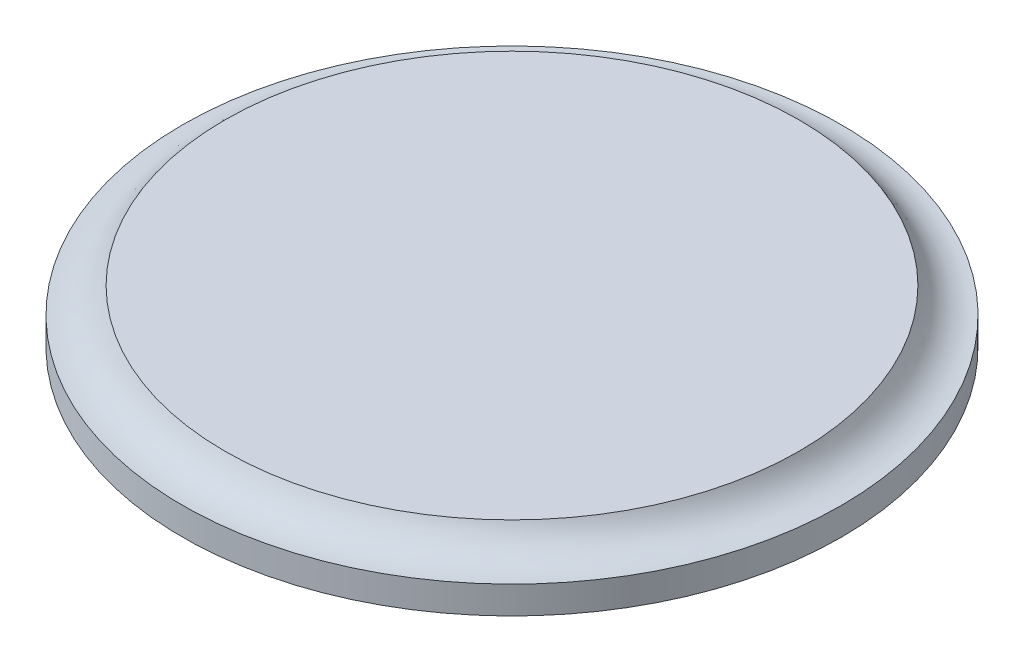
ISO-10303-21;
HEADER;
FILE_DESCRIPTION(('STEP AP214'),'2;1');
FILE_NAME('part.step','',(''),(''),'','','');
FILE_SCHEMA(('AUTOMOTIVE_DESIGN { 1 0 10303 214 1 1 1 1 }'));
ENDSEC;
DATA;
#1=APPLICATION_CONTEXT('core data for automotive mechanical design processes');
#2=APPLICATION_PROTOCOL_DEFINITION('international standard','automotive_design',2000,#1);
#3=PRODUCT_CONTEXT('',#1,'mechanical');
#4=PRODUCT('Part','Part','',(#3));
#5=PRODUCT_RELATED_PRODUCT_CATEGORY('part','',(#4));
#6=PRODUCT_DEFINITION_FORMATION('','',#4);
#7=PRODUCT_DEFINITION_CONTEXT('part definition',#1,'design');
#8=PRODUCT_DEFINITION('design','',#6,#7);
#9=PRODUCT_DEFINITION_SHAPE('','',#8);
#10=(LENGTH_UNIT() NAMED_UNIT(*) SI_UNIT(.MILLI.,.METRE.));
#11=(NAMED_UNIT(*) PLANE_ANGLE_UNIT() SI_UNIT($,.RADIAN.));
#12=(NAMED_UNIT(*) SI_UNIT($,.STERADIAN.) SOLID_ANGLE_UNIT());
#13=UNCERTAINTY_MEASURE_WITH_UNIT(LENGTH_MEASURE(1.E-05),#10,'distance_accuracy_value','');
#14=(GEOMETRIC_REPRESENTATION_CONTEXT(3) GLOBAL_UNCERTAINTY_ASSIGNED_CONTEXT((#13)) GLOBAL_UNIT_ASSIGNED_CONTEXT((#10,
#11,#12)) REPRESENTATION_CONTEXT('',''));
#15=CARTESIAN_POINT('',(0.,0.,0.));
#16=DIRECTION('',(0.,0.,1.));
#17=DIRECTION('',(1.,0.,0.));
#18=AXIS2_PLACEMENT_3D('',#15,#16,#17);
#19=CARTESIAN_POINT('',(-29.,4.59556911423337,0.));
#20=CARTESIAN_POINT('',(-26.2155661279657,4.49393805797366,0.));
#21=CARTESIAN_POINT('',(-25.0000000000001,6.99999999999971,0.));
#22=B_SPLINE_CURVE_WITH_KNOTS('',2,(#19,#20,#21),.UNSPECIFIED.,.F.,.F.,(3,3),(0.,1.),.UNSPECIFIED.);
#23=CARTESIAN_POINT('',(1.99999999999993,6.99999999999999,0.));
#24=DIRECTION('',(0.,1.,0.));
#25=AXIS1_PLACEMENT('',#23,#24);
#26=SURFACE_OF_REVOLUTION('',#22,#25);
#27=CARTESIAN_POINT('',(1.99999999999993,7.00000000000001,0.));
#28=DIRECTION('',(0.,1.,0.));
#29=DIRECTION('',(-1.,0.,0.));
#30=AXIS2_PLACEMENT_3D('',#27,#28,#29);
#31=CIRCLE('',#30,27.);
#32=CARTESIAN_POINT('',(-25.0000000000001,6.99999999999971,0.));
#33=VERTEX_POINT('',#32);
#34=EDGE_CURVE('E53',#33,#33,#31,.T.);
#35=ORIENTED_EDGE('',*,*,#34,.F.);
#36=EDGE_LOOP('',(#35));
#37=FACE_BOUND('',#36,.T.);
#38=CARTESIAN_POINT('',(1.99999999999996,4.5955691142337,0.));
#39=DIRECTION('',(0.,1.,0.));
#40=DIRECTION('',(-1.,0.,0.));
#41=AXIS2_PLACEMENT_3D('',#38,#39,#40);
#42=CIRCLE('',#41,31.);
#43=CARTESIAN_POINT('',(-29.,4.59556911423337,0.));
#44=VERTEX_POINT('',#43);
#45=EDGE_CURVE('E10',#44,#44,#42,.T.);
#46=ORIENTED_EDGE('',*,*,#45,.T.);
#47=EDGE_LOOP('',(#46));
#48=FACE_BOUND('',#47,.T.);
#49=ADVANCED_FACE('F33',(#37,#48),#26,.T.);
#50=CARTESIAN_POINT('',(1.99999999999993,6.99999999999999,0.));
#51=DIRECTION('',(0.,1.,0.));
#52=DIRECTION('',(-1.,0.,0.));
#53=AXIS2_PLACEMENT_3D('',#50,#51,#52);
#54=CYLINDRICAL_SURFACE('',#53,31.);
#55=ORIENTED_EDGE('',*,*,#45,.F.);
#56=EDGE_LOOP('',(#55));
#57=FACE_BOUND('',#56,.T.);
#58=CARTESIAN_POINT('',(1.99999999999999,2.00000000000001,0.));
#59=DIRECTION('',(0.,1.,0.));
#60=DIRECTION('',(-1.,0.,0.));
#61=AXIS2_PLACEMENT_3D('',#58,#59,#60);
#62=CIRCLE('',#61,31.);
#63=CARTESIAN_POINT('',(-29.,1.99999999999967,0.));
#64=VERTEX_POINT('',#63);
#65=EDGE_CURVE('E40',#64,#64,#62,.T.);
#66=ORIENTED_EDGE('',*,*,#65,.T.);
#67=EDGE_LOOP('',(#66));
#68=FACE_BOUND('',#67,.T.);
#69=ADVANCED_FACE('F75',(#57,#68),#54,.T.);
#70=CARTESIAN_POINT('',(0.,1.99999999999998,0.));
#71=DIRECTION('',(0.,-1.,0.));
#72=DIRECTION('',(1.,0.,0.));
#73=AXIS2_PLACEMENT_3D('',#70,#71,#72);
#74=PLANE('',#73);
#75=CARTESIAN_POINT('',(1.99999999999999,2.00000000000001,0.));
#76=DIRECTION('',(0.,1.,0.));
#77=DIRECTION('',(-1.,0.,0.));
#78=AXIS2_PLACEMENT_3D('',#75,#76,#77);
#79=CIRCLE('',#78,18.3751454097074);
#80=CARTESIAN_POINT('',(-16.3751454097074,1.99999999999981,0.));
#81=VERTEX_POINT('',#80);
#82=EDGE_CURVE('E44',#81,#81,#79,.T.);
#83=ORIENTED_EDGE('',*,*,#82,.T.);
#84=EDGE_LOOP('',(#83));
#85=FACE_BOUND('',#84,.T.);
#86=ORIENTED_EDGE('',*,*,#65,.F.);
#87=EDGE_LOOP('',(#86));
#88=FACE_BOUND('',#87,.T.);
#89=ADVANCED_FACE('F71',(#85,#88),#74,.T.);
#90=CARTESIAN_POINT('',(-13.5,-1.66533453693773E-13,0.));
#91=CARTESIAN_POINT('',(-14.3255550344944,1.74446076365027,0.));
#92=CARTESIAN_POINT('',(-16.3751454097074,1.9999999999998,0.));
#93=B_SPLINE_CURVE_WITH_KNOTS('',2,(#90,#91,#92),.UNSPECIFIED.,.F.,.F.,(3,3),(0.,1.),.UNSPECIFIED.);
#94=CARTESIAN_POINT('',(1.99999999999993,6.99999999999999,0.));
#95=DIRECTION('',(0.,1.,0.));
#96=AXIS1_PLACEMENT('',#94,#95);
#97=SURFACE_OF_REVOLUTION('',#93,#96);
#98=ORIENTED_EDGE('',*,*,#82,.F.);
#99=EDGE_LOOP('',(#98));
#100=FACE_BOUND('',#99,.T.);
#101=CARTESIAN_POINT('',(2.00000000000001,0.,0.));
#102=DIRECTION('',(0.,1.,0.));
#103=DIRECTION('',(-1.,0.,0.));
#104=AXIS2_PLACEMENT_3D('',#101,#102,#103);
#105=CIRCLE('',#104,15.5);
#106=CARTESIAN_POINT('',(-13.5,-1.66409544874061E-13,0.));
#107=VERTEX_POINT('',#106);
#108=EDGE_CURVE('E48',#107,#107,#105,.T.);
#109=ORIENTED_EDGE('',*,*,#108,.T.);
#110=EDGE_LOOP('',(#109));
#111=FACE_BOUND('',#110,.T.);
#112=ADVANCED_FACE('F66',(#100,#111),#97,.T.);
#113=CARTESIAN_POINT('',(0.,0.,0.));
#114=DIRECTION('',(0.,-1.,0.));
#115=DIRECTION('',(1.,0.,0.));
#116=AXIS2_PLACEMENT_3D('',#113,#114,#115);
#117=PLANE('',#116);
#118=ORIENTED_EDGE('',*,*,#108,.F.);
#119=EDGE_LOOP('',(#118));
#120=FACE_BOUND('',#119,.T.);
#121=ADVANCED_FACE('F70',(#120),#117,.T.);
#122=CARTESIAN_POINT('',(0.,6.99999999999998,0.));
#123=DIRECTION('',(0.,-1.,0.));
#124=DIRECTION('',(1.,0.,0.));
#125=AXIS2_PLACEMENT_3D('',#122,#123,#124);
#126=PLANE('',#125);
#127=ORIENTED_EDGE('',*,*,#34,.T.);
#128=EDGE_LOOP('',(#127));
#129=FACE_BOUND('',#128,.T.);
#130=ADVANCED_FACE('F87',(#129),#126,.F.);
#131=CLOSED_SHELL('',(#49,#69,#89,#112,#121,#130));
#132=MANIFOLD_SOLID_BREP('B2',#131);
#133=ADVANCED_BREP_SHAPE_REPRESENTATION('',(#18,#132),#14);
#134=SHAPE_DEFINITION_REPRESENTATION(#9,#133);
ENDSEC;
END-ISO-10303-21;
